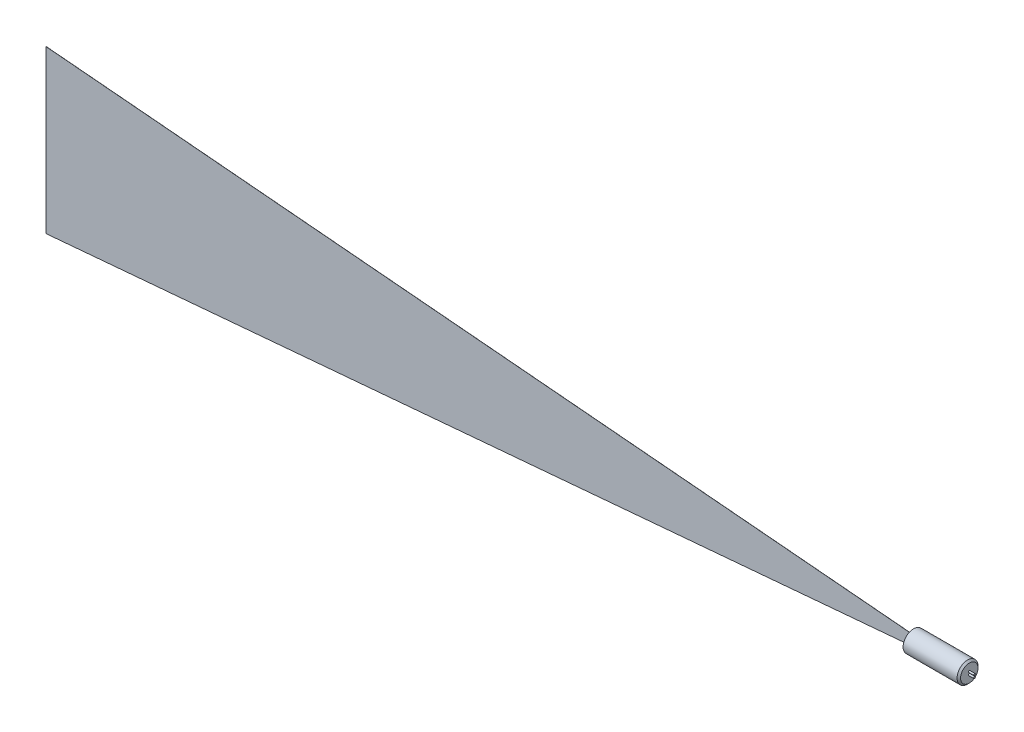
ISO-10303-21;
HEADER;
FILE_DESCRIPTION(('STEP AP214'),'2;1');
FILE_NAME('part.step','',(''),(''),'','','');
FILE_SCHEMA(('AUTOMOTIVE_DESIGN { 1 0 10303 214 1 1 1 1 }'));
ENDSEC;
DATA;
#1=APPLICATION_CONTEXT('core data for automotive mechanical design processes');
#2=APPLICATION_PROTOCOL_DEFINITION('international standard','automotive_design',2000,#1);
#3=PRODUCT_CONTEXT('',#1,'mechanical');
#4=PRODUCT('Part','Part','',(#3));
#5=PRODUCT_RELATED_PRODUCT_CATEGORY('part','',(#4));
#6=PRODUCT_DEFINITION_FORMATION('','',#4);
#7=PRODUCT_DEFINITION_CONTEXT('part definition',#1,'design');
#8=PRODUCT_DEFINITION('design','',#6,#7);
#9=PRODUCT_DEFINITION_SHAPE('','',#8);
#10=(LENGTH_UNIT() NAMED_UNIT(*) SI_UNIT(.MILLI.,.METRE.));
#11=(NAMED_UNIT(*) PLANE_ANGLE_UNIT() SI_UNIT($,.RADIAN.));
#12=(NAMED_UNIT(*) SI_UNIT($,.STERADIAN.) SOLID_ANGLE_UNIT());
#13=UNCERTAINTY_MEASURE_WITH_UNIT(LENGTH_MEASURE(1.E-05),#10,'distance_accuracy_value','');
#14=(GEOMETRIC_REPRESENTATION_CONTEXT(3) GLOBAL_UNCERTAINTY_ASSIGNED_CONTEXT((#13)) GLOBAL_UNIT_ASSIGNED_CONTEXT((#10,
#11,#12)) REPRESENTATION_CONTEXT('',''));
#15=CARTESIAN_POINT('',(0.,0.,0.));
#16=DIRECTION('',(0.,0.,1.));
#17=DIRECTION('',(1.,0.,0.));
#18=AXIS2_PLACEMENT_3D('',#15,#16,#17);
#19=CARTESIAN_POINT('',(2.,0.,0.));
#20=DIRECTION('',(-1.,0.,0.));
#21=DIRECTION('',(0.,0.,1.));
#22=AXIS2_PLACEMENT_3D('',#19,#20,#21);
#23=PLANE('',#22);
#24=CARTESIAN_POINT('',(2.,0.,0.));
#25=DIRECTION('',(-1.,0.,0.));
#26=DIRECTION('',(0.,0.,1.));
#27=AXIS2_PLACEMENT_3D('',#24,#25,#26);
#28=CIRCLE('',#27,3.4);
#29=CARTESIAN_POINT('',(2.,0.,3.4));
#30=VERTEX_POINT('',#29);
#31=EDGE_CURVE('E112',#30,#30,#28,.T.);
#32=ORIENTED_EDGE('',*,*,#31,.T.);
#33=EDGE_LOOP('',(#32));
#34=FACE_BOUND('',#33,.T.);
#35=DIRECTION('',(0.,0.,-1.));
#36=VECTOR('',#35,1.);
#37=CARTESIAN_POINT('',(1.99999999999978,2.75,0.05));
#38=LINE('',#37,#36);
#39=CARTESIAN_POINT('',(2.,2.74999999999998,0.05));
#40=VERTEX_POINT('',#39);
#41=CARTESIAN_POINT('',(2.,2.74999999999998,-0.05));
#42=VERTEX_POINT('',#41);
#43=EDGE_CURVE('E49',#40,#42,#38,.T.);
#44=ORIENTED_EDGE('',*,*,#43,.F.);
#45=DIRECTION('',(0.,1.,0.));
#46=VECTOR('',#45,1.);
#47=CARTESIAN_POINT('',(1.99999999999978,2.75,0.05));
#48=LINE('',#47,#46);
#49=CARTESIAN_POINT('',(2.,-2.74999999999998,0.05));
#50=VERTEX_POINT('',#49);
#51=EDGE_CURVE('E53',#50,#40,#48,.T.);
#52=ORIENTED_EDGE('',*,*,#51,.F.);
#53=DIRECTION('',(0.,0.,-1.));
#54=VECTOR('',#53,1.);
#55=CARTESIAN_POINT('',(1.99999999999978,-2.75,0.05));
#56=LINE('',#55,#54);
#57=CARTESIAN_POINT('',(1.99999999999978,-2.75,-0.05));
#58=VERTEX_POINT('',#57);
#59=EDGE_CURVE('E99',#50,#58,#56,.T.);
#60=ORIENTED_EDGE('',*,*,#59,.T.);
#61=DIRECTION('',(0.,1.,0.));
#62=VECTOR('',#61,1.);
#63=CARTESIAN_POINT('',(1.99999999999978,2.75,-0.05));
#64=LINE('',#63,#62);
#65=EDGE_CURVE('E89',#58,#42,#64,.T.);
#66=ORIENTED_EDGE('',*,*,#65,.T.);
#67=EDGE_LOOP('',(#44,#52,#60,#66));
#68=FACE_BOUND('',#67,.T.);
#69=ADVANCED_FACE('F34',(#34,#68),#23,.T.);
#70=CARTESIAN_POINT('',(32.,0.,0.));
#71=DIRECTION('',(1.,0.,0.));
#72=DIRECTION('',(0.,0.,-1.));
#73=AXIS2_PLACEMENT_3D('',#70,#71,#72);
#74=PLANE('',#73);
#75=CARTESIAN_POINT('',(32.,0.75,0.));
#76=DIRECTION('',(1.,0.,0.));
#77=DIRECTION('',(0.,0.,-1.));
#78=AXIS2_PLACEMENT_3D('',#75,#76,#77);
#79=CIRCLE('',#78,0.5);
#80=CARTESIAN_POINT('',(32.,0.75,-0.5));
#81=VERTEX_POINT('',#80);
#82=EDGE_CURVE('E104',#81,#81,#79,.T.);
#83=ORIENTED_EDGE('',*,*,#82,.F.);
#84=EDGE_LOOP('',(#83));
#85=FACE_BOUND('',#84,.T.);
#86=CARTESIAN_POINT('',(32.,0.,0.));
#87=DIRECTION('',(1.,0.,0.));
#88=DIRECTION('',(0.,0.,-1.));
#89=AXIS2_PLACEMENT_3D('',#86,#87,#88);
#90=CIRCLE('',#89,5.);
#91=CARTESIAN_POINT('',(32.,0.,-5.));
#92=VERTEX_POINT('',#91);
#93=EDGE_CURVE('E42',#92,#92,#90,.T.);
#94=ORIENTED_EDGE('',*,*,#93,.T.);
#95=EDGE_LOOP('',(#94));
#96=FACE_BOUND('',#95,.T.);
#97=CARTESIAN_POINT('',(32.,-0.75,0.));
#98=DIRECTION('',(1.,0.,0.));
#99=DIRECTION('',(0.,0.,1.));
#100=AXIS2_PLACEMENT_3D('',#97,#98,#99);
#101=CIRCLE('',#100,0.5);
#102=CARTESIAN_POINT('',(32.,-0.75,0.5));
#103=VERTEX_POINT('',#102);
#104=EDGE_CURVE('E94',#103,#103,#101,.T.);
#105=ORIENTED_EDGE('',*,*,#104,.F.);
#106=EDGE_LOOP('',(#105));
#107=FACE_BOUND('',#106,.T.);
#108=ADVANCED_FACE('F122',(#85,#96,#107),#74,.T.);
#109=CARTESIAN_POINT('',(32.,0.,0.));
#110=DIRECTION('',(-1.,0.,0.));
#111=DIRECTION('',(0.,0.,1.));
#112=AXIS2_PLACEMENT_3D('',#109,#110,#111);
#113=CYLINDRICAL_SURFACE('',#112,6.);
#114=CARTESIAN_POINT('',(31.,0.,0.));
#115=DIRECTION('',(1.,0.,0.));
#116=DIRECTION('',(0.,0.,-1.));
#117=AXIS2_PLACEMENT_3D('',#114,#115,#116);
#118=CIRCLE('',#117,6.);
#119=CARTESIAN_POINT('',(31.,0.,-6.));
#120=VERTEX_POINT('',#119);
#121=EDGE_CURVE('E11',#120,#120,#118,.F.);
#122=ORIENTED_EDGE('',*,*,#121,.T.);
#123=EDGE_LOOP('',(#122));
#124=FACE_BOUND('',#123,.T.);
#125=CARTESIAN_POINT('',(0.,0.,0.));
#126=DIRECTION('',(1.,0.,0.));
#127=DIRECTION('',(0.,0.,-1.));
#128=AXIS2_PLACEMENT_3D('',#125,#126,#127);
#129=CIRCLE('',#128,6.);
#130=CARTESIAN_POINT('',(0.,0.,-6.));
#131=VERTEX_POINT('',#130);
#132=EDGE_CURVE('E115',#131,#131,#129,.T.);
#133=ORIENTED_EDGE('',*,*,#132,.T.);
#134=EDGE_LOOP('',(#133));
#135=FACE_BOUND('',#134,.T.);
#136=ADVANCED_FACE('F146',(#124,#135),#113,.T.);
#137=CARTESIAN_POINT('',(0.,0.,0.));
#138=DIRECTION('',(1.,0.,0.));
#139=DIRECTION('',(0.,0.,-1.));
#140=AXIS2_PLACEMENT_3D('',#137,#138,#139);
#141=PLANE('',#140);
#142=CARTESIAN_POINT('',(0.,0.,0.));
#143=DIRECTION('',(-1.,0.,0.));
#144=DIRECTION('',(0.,0.,1.));
#145=AXIS2_PLACEMENT_3D('',#142,#143,#144);
#146=CIRCLE('',#145,3.4);
#147=CARTESIAN_POINT('',(0.,0.,3.4));
#148=VERTEX_POINT('',#147);
#149=EDGE_CURVE('E109',#148,#148,#146,.T.);
#150=ORIENTED_EDGE('',*,*,#149,.F.);
#151=EDGE_LOOP('',(#150));
#152=FACE_BOUND('',#151,.T.);
#153=ORIENTED_EDGE('',*,*,#132,.F.);
#154=EDGE_LOOP('',(#153));
#155=FACE_BOUND('',#154,.T.);
#156=ADVANCED_FACE('F136',(#152,#155),#141,.F.);
#157=CARTESIAN_POINT('',(2.,0.,0.));
#158=DIRECTION('',(-1.,0.,0.));
#159=DIRECTION('',(0.,0.,1.));
#160=AXIS2_PLACEMENT_3D('',#157,#158,#159);
#161=CYLINDRICAL_SURFACE('',#160,3.4);
#162=ORIENTED_EDGE('',*,*,#31,.F.);
#163=EDGE_LOOP('',(#162));
#164=FACE_BOUND('',#163,.T.);
#165=ORIENTED_EDGE('',*,*,#149,.T.);
#166=EDGE_LOOP('',(#165));
#167=FACE_BOUND('',#166,.T.);
#168=ADVANCED_FACE('F127',(#164,#167),#161,.F.);
#169=CARTESIAN_POINT('',(32.,0.,0.));
#170=DIRECTION('',(-1.,0.,0.));
#171=DIRECTION('',(0.,0.,1.));
#172=AXIS2_PLACEMENT_3D('',#169,#170,#171);
#173=CONICAL_SURFACE('',#172,5.,0.785398163397446);
#174=ORIENTED_EDGE('',*,*,#121,.F.);
#175=EDGE_LOOP('',(#174));
#176=FACE_BOUND('',#175,.T.);
#177=ORIENTED_EDGE('',*,*,#93,.F.);
#178=EDGE_LOOP('',(#177));
#179=FACE_BOUND('',#178,.T.);
#180=ADVANCED_FACE('F36',(#176,#179),#173,.T.);
#181=CARTESIAN_POINT('',(35.,0.75,0.));
#182=DIRECTION('',(-1.,0.,0.));
#183=DIRECTION('',(0.,0.,1.));
#184=AXIS2_PLACEMENT_3D('',#181,#182,#183);
#185=CYLINDRICAL_SURFACE('',#184,0.5);
#186=CARTESIAN_POINT('',(35.,0.75,0.));
#187=DIRECTION('',(1.,0.,0.));
#188=DIRECTION('',(0.,0.,-1.));
#189=AXIS2_PLACEMENT_3D('',#186,#187,#188);
#190=CIRCLE('',#189,0.5);
#191=CARTESIAN_POINT('',(35.,0.75,-0.5));
#192=VERTEX_POINT('',#191);
#193=EDGE_CURVE('E106',#192,#192,#190,.T.);
#194=ORIENTED_EDGE('',*,*,#193,.F.);
#195=EDGE_LOOP('',(#194));
#196=FACE_BOUND('',#195,.T.);
#197=ORIENTED_EDGE('',*,*,#82,.T.);
#198=EDGE_LOOP('',(#197));
#199=FACE_BOUND('',#198,.T.);
#200=ADVANCED_FACE('F126',(#196,#199),#185,.T.);
#201=CARTESIAN_POINT('',(35.,0.75,0.));
#202=DIRECTION('',(1.,0.,0.));
#203=DIRECTION('',(0.,0.,-1.));
#204=AXIS2_PLACEMENT_3D('',#201,#202,#203);
#205=PLANE('',#204);
#206=ORIENTED_EDGE('',*,*,#193,.T.);
#207=EDGE_LOOP('',(#206));
#208=FACE_BOUND('',#207,.T.);
#209=ADVANCED_FACE('F133',(#208),#205,.T.);
#210=CARTESIAN_POINT('',(35.,-0.75,0.));
#211=DIRECTION('',(-1.,0.,0.));
#212=DIRECTION('',(0.,0.,1.));
#213=AXIS2_PLACEMENT_3D('',#210,#211,#212);
#214=CYLINDRICAL_SURFACE('',#213,0.5);
#215=CARTESIAN_POINT('',(35.,-0.75,0.));
#216=DIRECTION('',(1.,0.,0.));
#217=DIRECTION('',(0.,0.,1.));
#218=AXIS2_PLACEMENT_3D('',#215,#216,#217);
#219=CIRCLE('',#218,0.5);
#220=CARTESIAN_POINT('',(35.,-0.75,0.5));
#221=VERTEX_POINT('',#220);
#222=EDGE_CURVE('E97',#221,#221,#219,.T.);
#223=ORIENTED_EDGE('',*,*,#222,.F.);
#224=EDGE_LOOP('',(#223));
#225=FACE_BOUND('',#224,.T.);
#226=ORIENTED_EDGE('',*,*,#104,.T.);
#227=EDGE_LOOP('',(#226));
#228=FACE_BOUND('',#227,.T.);
#229=ADVANCED_FACE('F205',(#225,#228),#214,.T.);
#230=CARTESIAN_POINT('',(35.,-0.75,0.));
#231=DIRECTION('',(-1.,0.,0.));
#232=DIRECTION('',(0.,0.,1.));
#233=AXIS2_PLACEMENT_3D('',#230,#231,#232);
#234=PLANE('',#233);
#235=ORIENTED_EDGE('',*,*,#222,.T.);
#236=EDGE_LOOP('',(#235));
#237=FACE_BOUND('',#236,.T.);
#238=ADVANCED_FACE('F216',(#237),#234,.F.);
#239=CARTESIAN_POINT('',(-498.,46.4943317629603,0.05));
#240=DIRECTION('',(-0.0871557427476547,-0.996194698091746,0.));
#241=DIRECTION('',(0.996194698091746,-0.0871557427476547,0.));
#242=AXIS2_PLACEMENT_3D('',#239,#240,#241);
#243=PLANE('',#242);
#244=DIRECTION('',(-0.996194698091746,0.0871557427476547,0.));
#245=VECTOR('',#244,1.);
#246=CARTESIAN_POINT('',(-498.,46.4943317629603,-0.05));
#247=LINE('',#246,#245);
#248=CARTESIAN_POINT('',(-498.,46.4943317629603,-0.05));
#249=VERTEX_POINT('',#248);
#250=EDGE_CURVE('E93',#42,#249,#247,.T.);
#251=ORIENTED_EDGE('',*,*,#250,.T.);
#252=DIRECTION('',(0.,0.,-1.));
#253=VECTOR('',#252,1.);
#254=CARTESIAN_POINT('',(-498.,46.4943317629603,0.05));
#255=LINE('',#254,#253);
#256=CARTESIAN_POINT('',(-498.,46.4943317629603,0.05));
#257=VERTEX_POINT('',#256);
#258=EDGE_CURVE('E77',#257,#249,#255,.T.);
#259=ORIENTED_EDGE('',*,*,#258,.F.);
#260=DIRECTION('',(-0.996194698091746,0.0871557427476547,0.));
#261=VECTOR('',#260,1.);
#262=CARTESIAN_POINT('',(-498.,46.4943317629603,0.05));
#263=LINE('',#262,#261);
#264=EDGE_CURVE('E84',#40,#257,#263,.T.);
#265=ORIENTED_EDGE('',*,*,#264,.F.);
#266=ORIENTED_EDGE('',*,*,#43,.T.);
#267=EDGE_LOOP('',(#251,#259,#265,#266));
#268=FACE_BOUND('',#267,.T.);
#269=ADVANCED_FACE('F91',(#268),#243,.F.);
#270=CARTESIAN_POINT('',(-498.,46.4943317629603,0.05));
#271=DIRECTION('',(1.,0.,0.));
#272=DIRECTION('',(0.,0.,-1.));
#273=AXIS2_PLACEMENT_3D('',#270,#271,#272);
#274=PLANE('',#273);
#275=DIRECTION('',(0.,-1.,0.));
#276=VECTOR('',#275,1.);
#277=CARTESIAN_POINT('',(-498.,46.4943317629603,-0.05));
#278=LINE('',#277,#276);
#279=CARTESIAN_POINT('',(-498.,-46.4943317629603,-0.05));
#280=VERTEX_POINT('',#279);
#281=EDGE_CURVE('E280',#249,#280,#278,.T.);
#282=ORIENTED_EDGE('',*,*,#281,.T.);
#283=DIRECTION('',(0.,0.,-1.));
#284=VECTOR('',#283,1.);
#285=CARTESIAN_POINT('',(-498.,-46.4943317629603,0.05));
#286=LINE('',#285,#284);
#287=CARTESIAN_POINT('',(-498.,-46.4943317629603,0.05));
#288=VERTEX_POINT('',#287);
#289=EDGE_CURVE('E80',#288,#280,#286,.T.);
#290=ORIENTED_EDGE('',*,*,#289,.F.);
#291=DIRECTION('',(0.,-1.,0.));
#292=VECTOR('',#291,1.);
#293=CARTESIAN_POINT('',(-498.,46.4943317629603,0.05));
#294=LINE('',#293,#292);
#295=EDGE_CURVE('E73',#257,#288,#294,.T.);
#296=ORIENTED_EDGE('',*,*,#295,.F.);
#297=ORIENTED_EDGE('',*,*,#258,.T.);
#298=EDGE_LOOP('',(#282,#290,#296,#297));
#299=FACE_BOUND('',#298,.T.);
#300=ADVANCED_FACE('F75',(#299),#274,.F.);
#301=CARTESIAN_POINT('',(1.99999999999978,-2.75,0.05));
#302=DIRECTION('',(-0.0871557427476547,0.996194698091746,0.));
#303=DIRECTION('',(-0.996194698091746,-0.0871557427476547,0.));
#304=AXIS2_PLACEMENT_3D('',#301,#302,#303);
#305=PLANE('',#304);
#306=DIRECTION('',(0.996194698091746,0.0871557427476547,0.));
#307=VECTOR('',#306,1.);
#308=CARTESIAN_POINT('',(1.99999999999978,-2.75,-0.05));
#309=LINE('',#308,#307);
#310=EDGE_CURVE('E282',#280,#58,#309,.T.);
#311=ORIENTED_EDGE('',*,*,#310,.T.);
#312=ORIENTED_EDGE('',*,*,#59,.F.);
#313=DIRECTION('',(0.996194698091746,0.0871557427476547,0.));
#314=VECTOR('',#313,1.);
#315=CARTESIAN_POINT('',(1.99999999999978,-2.75,0.05));
#316=LINE('',#315,#314);
#317=EDGE_CURVE('E83',#288,#50,#316,.T.);
#318=ORIENTED_EDGE('',*,*,#317,.F.);
#319=ORIENTED_EDGE('',*,*,#289,.T.);
#320=EDGE_LOOP('',(#311,#312,#318,#319));
#321=FACE_BOUND('',#320,.T.);
#322=ADVANCED_FACE('F247',(#321),#305,.F.);
#323=CARTESIAN_POINT('',(-498.,46.4943317629603,0.05));
#324=DIRECTION('',(0.,0.,-1.));
#325=DIRECTION('',(-1.,0.,0.));
#326=AXIS2_PLACEMENT_3D('',#323,#324,#325);
#327=PLANE('',#326);
#328=ORIENTED_EDGE('',*,*,#264,.T.);
#329=ORIENTED_EDGE('',*,*,#295,.T.);
#330=ORIENTED_EDGE('',*,*,#317,.T.);
#331=ORIENTED_EDGE('',*,*,#51,.T.);
#332=EDGE_LOOP('',(#328,#329,#330,#331));
#333=FACE_BOUND('',#332,.T.);
#334=ADVANCED_FACE('F87',(#333),#327,.F.);
#335=CARTESIAN_POINT('',(-498.,46.4943317629603,-0.05));
#336=DIRECTION('',(0.,0.,-1.));
#337=DIRECTION('',(-1.,0.,0.));
#338=AXIS2_PLACEMENT_3D('',#335,#336,#337);
#339=PLANE('',#338);
#340=ORIENTED_EDGE('',*,*,#250,.F.);
#341=ORIENTED_EDGE('',*,*,#65,.F.);
#342=ORIENTED_EDGE('',*,*,#310,.F.);
#343=ORIENTED_EDGE('',*,*,#281,.F.);
#344=EDGE_LOOP('',(#340,#341,#342,#343));
#345=FACE_BOUND('',#344,.T.);
#346=ADVANCED_FACE('F265',(#345),#339,.T.);
#347=CLOSED_SHELL('',(#69,#108,#136,#156,#168,#180,#200,#209,#229,#238,#269,#300,#322,#334,#346));
#348=MANIFOLD_SOLID_BREP('B2',#347);
#349=ADVANCED_BREP_SHAPE_REPRESENTATION('',(#18,#348),#14);
#350=SHAPE_DEFINITION_REPRESENTATION(#9,#349);
ENDSEC;
END-ISO-10303-21;
